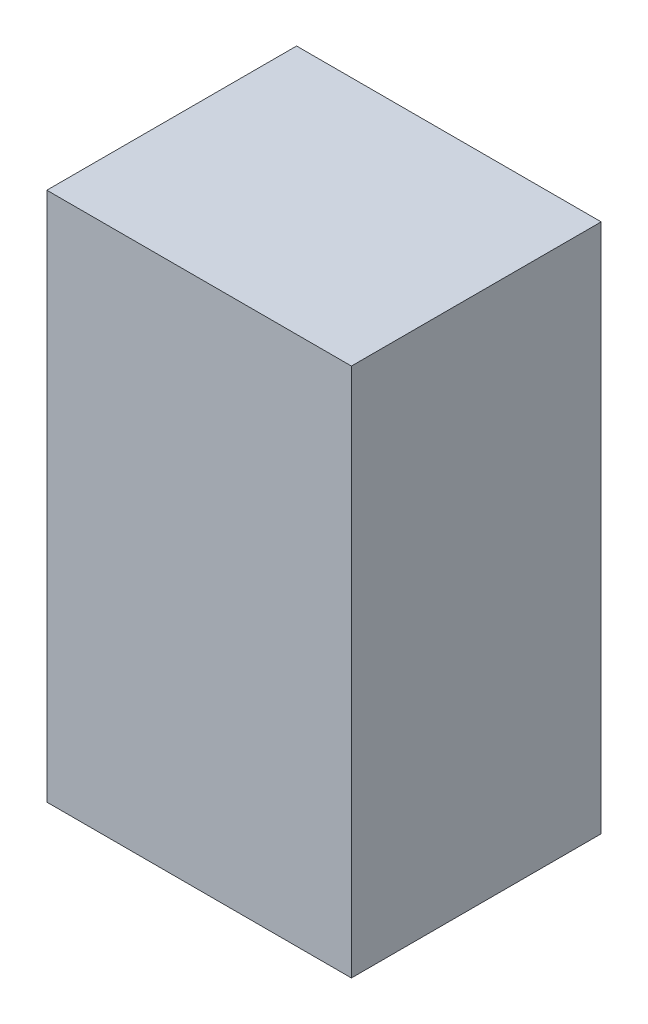
ISO-10303-21;
HEADER;
FILE_DESCRIPTION(('STEP AP214'),'2;1');
FILE_NAME('part.step','',(''),(''),'','','');
FILE_SCHEMA(('AUTOMOTIVE_DESIGN { 1 0 10303 214 1 1 1 1 }'));
ENDSEC;
DATA;
#1=APPLICATION_CONTEXT('core data for automotive mechanical design processes');
#2=APPLICATION_PROTOCOL_DEFINITION('international standard','automotive_design',2000,#1);
#3=PRODUCT_CONTEXT('',#1,'mechanical');
#4=PRODUCT('Part','Part','',(#3));
#5=PRODUCT_RELATED_PRODUCT_CATEGORY('part','',(#4));
#6=PRODUCT_DEFINITION_FORMATION('','',#4);
#7=PRODUCT_DEFINITION_CONTEXT('part definition',#1,'design');
#8=PRODUCT_DEFINITION('design','',#6,#7);
#9=PRODUCT_DEFINITION_SHAPE('','',#8);
#10=(LENGTH_UNIT() NAMED_UNIT(*) SI_UNIT(.MILLI.,.METRE.));
#11=(NAMED_UNIT(*) PLANE_ANGLE_UNIT() SI_UNIT($,.RADIAN.));
#12=(NAMED_UNIT(*) SI_UNIT($,.STERADIAN.) SOLID_ANGLE_UNIT());
#13=UNCERTAINTY_MEASURE_WITH_UNIT(LENGTH_MEASURE(1.E-05),#10,'distance_accuracy_value','');
#14=(GEOMETRIC_REPRESENTATION_CONTEXT(3) GLOBAL_UNCERTAINTY_ASSIGNED_CONTEXT((#13)) GLOBAL_UNIT_ASSIGNED_CONTEXT((#10,
#11,#12)) REPRESENTATION_CONTEXT('',''));
#15=CARTESIAN_POINT('',(0.,0.,0.));
#16=DIRECTION('',(0.,0.,1.));
#17=DIRECTION('',(1.,0.,0.));
#18=AXIS2_PLACEMENT_3D('',#15,#16,#17);
#19=CARTESIAN_POINT('',(25.,43.5,41.));
#20=DIRECTION('',(-1.,0.,0.));
#21=DIRECTION('',(0.,-1.,0.));
#22=AXIS2_PLACEMENT_3D('',#19,#20,#21);
#23=PLANE('',#22);
#24=DIRECTION('',(0.,1.,0.));
#25=VECTOR('',#24,1.);
#26=CARTESIAN_POINT('',(25.,43.5,0.));
#27=LINE('',#26,#25);
#28=CARTESIAN_POINT('',(25.,-43.5,0.));
#29=VERTEX_POINT('',#28);
#30=CARTESIAN_POINT('',(25.,43.5,0.));
#31=VERTEX_POINT('',#30);
#32=EDGE_CURVE('E96',#29,#31,#27,.T.);
#33=ORIENTED_EDGE('',*,*,#32,.T.);
#34=DIRECTION('',(0.,0.,-1.));
#35=VECTOR('',#34,1.);
#36=CARTESIAN_POINT('',(25.,43.5,41.));
#37=LINE('',#36,#35);
#38=CARTESIAN_POINT('',(25.,43.5,41.));
#39=VERTEX_POINT('',#38);
#40=EDGE_CURVE('E11',#39,#31,#37,.T.);
#41=ORIENTED_EDGE('',*,*,#40,.F.);
#42=DIRECTION('',(0.,1.,0.));
#43=VECTOR('',#42,1.);
#44=CARTESIAN_POINT('',(25.,43.5,41.));
#45=LINE('',#44,#43);
#46=CARTESIAN_POINT('',(25.,-43.5,41.));
#47=VERTEX_POINT('',#46);
#48=EDGE_CURVE('E84',#47,#39,#45,.T.);
#49=ORIENTED_EDGE('',*,*,#48,.F.);
#50=DIRECTION('',(0.,0.,-1.));
#51=VECTOR('',#50,1.);
#52=CARTESIAN_POINT('',(25.,-43.5,41.));
#53=LINE('',#52,#51);
#54=EDGE_CURVE('E92',#47,#29,#53,.T.);
#55=ORIENTED_EDGE('',*,*,#54,.T.);
#56=EDGE_LOOP('',(#33,#41,#49,#55));
#57=FACE_BOUND('',#56,.T.);
#58=ADVANCED_FACE('F33',(#57),#23,.F.);
#59=CARTESIAN_POINT('',(-25.,43.5,41.));
#60=DIRECTION('',(0.,-1.,0.));
#61=DIRECTION('',(0.,0.,-1.));
#62=AXIS2_PLACEMENT_3D('',#59,#60,#61);
#63=PLANE('',#62);
#64=DIRECTION('',(-1.,0.,0.));
#65=VECTOR('',#64,1.);
#66=CARTESIAN_POINT('',(-25.,43.5,0.));
#67=LINE('',#66,#65);
#68=CARTESIAN_POINT('',(-25.,43.5,0.));
#69=VERTEX_POINT('',#68);
#70=EDGE_CURVE('E88',#31,#69,#67,.T.);
#71=ORIENTED_EDGE('',*,*,#70,.T.);
#72=DIRECTION('',(0.,0.,-1.));
#73=VECTOR('',#72,1.);
#74=CARTESIAN_POINT('',(-25.,43.5,41.));
#75=LINE('',#74,#73);
#76=CARTESIAN_POINT('',(-25.,43.5,41.));
#77=VERTEX_POINT('',#76);
#78=EDGE_CURVE('E41',#77,#69,#75,.T.);
#79=ORIENTED_EDGE('',*,*,#78,.F.);
#80=DIRECTION('',(-1.,0.,0.));
#81=VECTOR('',#80,1.);
#82=CARTESIAN_POINT('',(-25.,43.5,41.));
#83=LINE('',#82,#81);
#84=EDGE_CURVE('E79',#39,#77,#83,.T.);
#85=ORIENTED_EDGE('',*,*,#84,.F.);
#86=ORIENTED_EDGE('',*,*,#40,.T.);
#87=EDGE_LOOP('',(#71,#79,#85,#86));
#88=FACE_BOUND('',#87,.T.);
#89=ADVANCED_FACE('F87',(#88),#63,.F.);
#90=CARTESIAN_POINT('',(-25.,43.5,41.));
#91=DIRECTION('',(1.,0.,0.));
#92=DIRECTION('',(0.,1.,0.));
#93=AXIS2_PLACEMENT_3D('',#90,#91,#92);
#94=PLANE('',#93);
#95=DIRECTION('',(0.,-1.,0.));
#96=VECTOR('',#95,1.);
#97=CARTESIAN_POINT('',(-25.,43.5,0.));
#98=LINE('',#97,#96);
#99=CARTESIAN_POINT('',(-25.,-43.5,0.));
#100=VERTEX_POINT('',#99);
#101=EDGE_CURVE('E66',#69,#100,#98,.T.);
#102=ORIENTED_EDGE('',*,*,#101,.T.);
#103=DIRECTION('',(0.,0.,-1.));
#104=VECTOR('',#103,1.);
#105=CARTESIAN_POINT('',(-25.,-43.5,41.));
#106=LINE('',#105,#104);
#107=CARTESIAN_POINT('',(-25.,-43.5,41.));
#108=VERTEX_POINT('',#107);
#109=EDGE_CURVE('E89',#108,#100,#106,.T.);
#110=ORIENTED_EDGE('',*,*,#109,.F.);
#111=DIRECTION('',(0.,-1.,0.));
#112=VECTOR('',#111,1.);
#113=CARTESIAN_POINT('',(-25.,43.5,41.));
#114=LINE('',#113,#112);
#115=EDGE_CURVE('E82',#77,#108,#114,.T.);
#116=ORIENTED_EDGE('',*,*,#115,.F.);
#117=ORIENTED_EDGE('',*,*,#78,.T.);
#118=EDGE_LOOP('',(#102,#110,#116,#117));
#119=FACE_BOUND('',#118,.T.);
#120=ADVANCED_FACE('F90',(#119),#94,.F.);
#121=CARTESIAN_POINT('',(-25.,-43.5,41.));
#122=DIRECTION('',(0.,1.,0.));
#123=DIRECTION('',(0.,0.,1.));
#124=AXIS2_PLACEMENT_3D('',#121,#122,#123);
#125=PLANE('',#124);
#126=DIRECTION('',(1.,0.,0.));
#127=VECTOR('',#126,1.);
#128=CARTESIAN_POINT('',(-25.,-43.5,0.));
#129=LINE('',#128,#127);
#130=EDGE_CURVE('E72',#100,#29,#129,.T.);
#131=ORIENTED_EDGE('',*,*,#130,.T.);
#132=ORIENTED_EDGE('',*,*,#54,.F.);
#133=DIRECTION('',(1.,0.,0.));
#134=VECTOR('',#133,1.);
#135=CARTESIAN_POINT('',(-25.,-43.5,41.));
#136=LINE('',#135,#134);
#137=EDGE_CURVE('E49',#108,#47,#136,.T.);
#138=ORIENTED_EDGE('',*,*,#137,.F.);
#139=ORIENTED_EDGE('',*,*,#109,.T.);
#140=EDGE_LOOP('',(#131,#132,#138,#139));
#141=FACE_BOUND('',#140,.T.);
#142=ADVANCED_FACE('F103',(#141),#125,.F.);
#143=CARTESIAN_POINT('',(0.,0.,41.));
#144=DIRECTION('',(0.,0.,1.));
#145=DIRECTION('',(1.,0.,0.));
#146=AXIS2_PLACEMENT_3D('',#143,#144,#145);
#147=PLANE('',#146);
#148=ORIENTED_EDGE('',*,*,#48,.T.);
#149=ORIENTED_EDGE('',*,*,#84,.T.);
#150=ORIENTED_EDGE('',*,*,#115,.T.);
#151=ORIENTED_EDGE('',*,*,#137,.T.);
#152=EDGE_LOOP('',(#148,#149,#150,#151));
#153=FACE_BOUND('',#152,.T.);
#154=ADVANCED_FACE('F80',(#153),#147,.T.);
#155=CARTESIAN_POINT('',(0.,0.,0.));
#156=DIRECTION('',(0.,0.,1.));
#157=DIRECTION('',(1.,0.,0.));
#158=AXIS2_PLACEMENT_3D('',#155,#156,#157);
#159=PLANE('',#158);
#160=ORIENTED_EDGE('',*,*,#32,.F.);
#161=ORIENTED_EDGE('',*,*,#130,.F.);
#162=ORIENTED_EDGE('',*,*,#101,.F.);
#163=ORIENTED_EDGE('',*,*,#70,.F.);
#164=EDGE_LOOP('',(#160,#161,#162,#163));
#165=FACE_BOUND('',#164,.T.);
#166=ADVANCED_FACE('F106',(#165),#159,.F.);
#167=CLOSED_SHELL('',(#58,#89,#120,#142,#154,#166));
#168=MANIFOLD_SOLID_BREP('B2',#167);
#169=ADVANCED_BREP_SHAPE_REPRESENTATION('',(#18,#168),#14);
#170=SHAPE_DEFINITION_REPRESENTATION(#9,#169);
ENDSEC;
END-ISO-10303-21;
